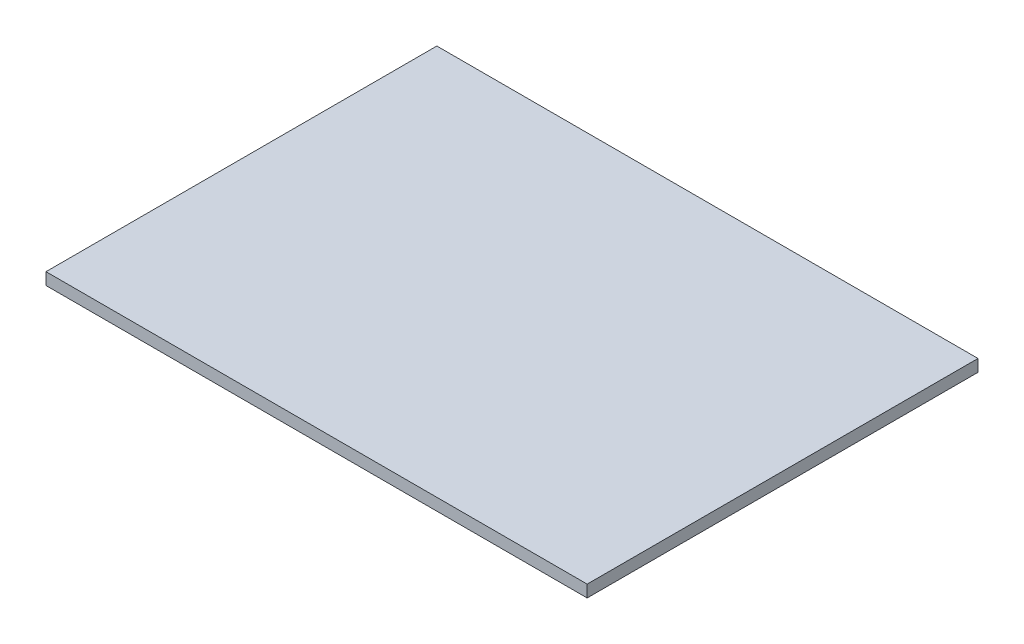
ISO-10303-21;
HEADER;
FILE_DESCRIPTION(('STEP AP214'),'2;1');
FILE_NAME('part.step','',(''),(''),'','','');
FILE_SCHEMA(('AUTOMOTIVE_DESIGN { 1 0 10303 214 1 1 1 1 }'));
ENDSEC;
DATA;
#1=APPLICATION_CONTEXT('core data for automotive mechanical design processes');
#2=APPLICATION_PROTOCOL_DEFINITION('international standard','automotive_design',2000,#1);
#3=PRODUCT_CONTEXT('',#1,'mechanical');
#4=PRODUCT('Part','Part','',(#3));
#5=PRODUCT_RELATED_PRODUCT_CATEGORY('part','',(#4));
#6=PRODUCT_DEFINITION_FORMATION('','',#4);
#7=PRODUCT_DEFINITION_CONTEXT('part definition',#1,'design');
#8=PRODUCT_DEFINITION('design','',#6,#7);
#9=PRODUCT_DEFINITION_SHAPE('','',#8);
#10=(LENGTH_UNIT() NAMED_UNIT(*) SI_UNIT(.MILLI.,.METRE.));
#11=(NAMED_UNIT(*) PLANE_ANGLE_UNIT() SI_UNIT($,.RADIAN.));
#12=(NAMED_UNIT(*) SI_UNIT($,.STERADIAN.) SOLID_ANGLE_UNIT());
#13=UNCERTAINTY_MEASURE_WITH_UNIT(LENGTH_MEASURE(1.E-05),#10,'distance_accuracy_value','');
#14=(GEOMETRIC_REPRESENTATION_CONTEXT(3) GLOBAL_UNCERTAINTY_ASSIGNED_CONTEXT((#13)) GLOBAL_UNIT_ASSIGNED_CONTEXT((#10,
#11,#12)) REPRESENTATION_CONTEXT('',''));
#15=CARTESIAN_POINT('',(0.,0.,0.));
#16=DIRECTION('',(0.,0.,1.));
#17=DIRECTION('',(1.,0.,0.));
#18=AXIS2_PLACEMENT_3D('',#15,#16,#17);
#19=CARTESIAN_POINT('',(0.,2.,0.));
#20=DIRECTION('',(1.,0.,0.));
#21=DIRECTION('',(0.,0.,-1.));
#22=AXIS2_PLACEMENT_3D('',#19,#20,#21);
#23=PLANE('',#22);
#24=DIRECTION('',(0.,0.,1.));
#25=VECTOR('',#24,1.);
#26=CARTESIAN_POINT('',(0.,0.,0.));
#27=LINE('',#26,#25);
#28=CARTESIAN_POINT('',(0.,0.,-65.));
#29=VERTEX_POINT('',#28);
#30=CARTESIAN_POINT('',(0.,0.,0.));
#31=VERTEX_POINT('',#30);
#32=EDGE_CURVE('E98',#29,#31,#27,.T.);
#33=ORIENTED_EDGE('',*,*,#32,.T.);
#34=DIRECTION('',(0.,-1.,0.));
#35=VECTOR('',#34,1.);
#36=CARTESIAN_POINT('',(0.,2.,0.));
#37=LINE('',#36,#35);
#38=CARTESIAN_POINT('',(0.,2.,0.));
#39=VERTEX_POINT('',#38);
#40=EDGE_CURVE('E11',#39,#31,#37,.T.);
#41=ORIENTED_EDGE('',*,*,#40,.F.);
#42=DIRECTION('',(0.,0.,1.));
#43=VECTOR('',#42,1.);
#44=CARTESIAN_POINT('',(0.,2.,0.));
#45=LINE('',#44,#43);
#46=CARTESIAN_POINT('',(0.,2.,-65.));
#47=VERTEX_POINT('',#46);
#48=EDGE_CURVE('E86',#47,#39,#45,.T.);
#49=ORIENTED_EDGE('',*,*,#48,.F.);
#50=DIRECTION('',(0.,-1.,0.));
#51=VECTOR('',#50,1.);
#52=CARTESIAN_POINT('',(0.,2.,-65.));
#53=LINE('',#52,#51);
#54=EDGE_CURVE('E94',#47,#29,#53,.T.);
#55=ORIENTED_EDGE('',*,*,#54,.T.);
#56=EDGE_LOOP('',(#33,#41,#49,#55));
#57=FACE_BOUND('',#56,.T.);
#58=ADVANCED_FACE('F35',(#57),#23,.F.);
#59=CARTESIAN_POINT('',(0.,2.,0.));
#60=DIRECTION('',(0.,0.,-1.));
#61=DIRECTION('',(-1.,0.,0.));
#62=AXIS2_PLACEMENT_3D('',#59,#60,#61);
#63=PLANE('',#62);
#64=DIRECTION('',(1.,0.,0.));
#65=VECTOR('',#64,1.);
#66=CARTESIAN_POINT('',(0.,0.,0.));
#67=LINE('',#66,#65);
#68=CARTESIAN_POINT('',(90.,0.,0.));
#69=VERTEX_POINT('',#68);
#70=EDGE_CURVE('E90',#31,#69,#67,.T.);
#71=ORIENTED_EDGE('',*,*,#70,.T.);
#72=DIRECTION('',(0.,-1.,0.));
#73=VECTOR('',#72,1.);
#74=CARTESIAN_POINT('',(90.,2.,0.));
#75=LINE('',#74,#73);
#76=CARTESIAN_POINT('',(90.,2.,0.));
#77=VERTEX_POINT('',#76);
#78=EDGE_CURVE('E43',#77,#69,#75,.T.);
#79=ORIENTED_EDGE('',*,*,#78,.F.);
#80=DIRECTION('',(1.,0.,0.));
#81=VECTOR('',#80,1.);
#82=CARTESIAN_POINT('',(0.,2.,0.));
#83=LINE('',#82,#81);
#84=EDGE_CURVE('E81',#39,#77,#83,.T.);
#85=ORIENTED_EDGE('',*,*,#84,.F.);
#86=ORIENTED_EDGE('',*,*,#40,.T.);
#87=EDGE_LOOP('',(#71,#79,#85,#86));
#88=FACE_BOUND('',#87,.T.);
#89=ADVANCED_FACE('F89',(#88),#63,.F.);
#90=CARTESIAN_POINT('',(90.,2.,0.));
#91=DIRECTION('',(-1.,0.,0.));
#92=DIRECTION('',(0.,0.,1.));
#93=AXIS2_PLACEMENT_3D('',#90,#91,#92);
#94=PLANE('',#93);
#95=DIRECTION('',(0.,0.,-1.));
#96=VECTOR('',#95,1.);
#97=CARTESIAN_POINT('',(90.,0.,0.));
#98=LINE('',#97,#96);
#99=CARTESIAN_POINT('',(90.,0.,-65.));
#100=VERTEX_POINT('',#99);
#101=EDGE_CURVE('E68',#69,#100,#98,.T.);
#102=ORIENTED_EDGE('',*,*,#101,.T.);
#103=DIRECTION('',(0.,-1.,0.));
#104=VECTOR('',#103,1.);
#105=CARTESIAN_POINT('',(90.,2.,-65.));
#106=LINE('',#105,#104);
#107=CARTESIAN_POINT('',(90.,2.,-65.));
#108=VERTEX_POINT('',#107);
#109=EDGE_CURVE('E91',#108,#100,#106,.T.);
#110=ORIENTED_EDGE('',*,*,#109,.F.);
#111=DIRECTION('',(0.,0.,-1.));
#112=VECTOR('',#111,1.);
#113=CARTESIAN_POINT('',(90.,2.,0.));
#114=LINE('',#113,#112);
#115=EDGE_CURVE('E84',#77,#108,#114,.T.);
#116=ORIENTED_EDGE('',*,*,#115,.F.);
#117=ORIENTED_EDGE('',*,*,#78,.T.);
#118=EDGE_LOOP('',(#102,#110,#116,#117));
#119=FACE_BOUND('',#118,.T.);
#120=ADVANCED_FACE('F92',(#119),#94,.F.);
#121=CARTESIAN_POINT('',(0.,2.,-65.));
#122=DIRECTION('',(0.,0.,1.));
#123=DIRECTION('',(1.,0.,0.));
#124=AXIS2_PLACEMENT_3D('',#121,#122,#123);
#125=PLANE('',#124);
#126=DIRECTION('',(-1.,0.,0.));
#127=VECTOR('',#126,1.);
#128=CARTESIAN_POINT('',(0.,0.,-65.));
#129=LINE('',#128,#127);
#130=EDGE_CURVE('E74',#100,#29,#129,.T.);
#131=ORIENTED_EDGE('',*,*,#130,.T.);
#132=ORIENTED_EDGE('',*,*,#54,.F.);
#133=DIRECTION('',(-1.,0.,0.));
#134=VECTOR('',#133,1.);
#135=CARTESIAN_POINT('',(0.,2.,-65.));
#136=LINE('',#135,#134);
#137=EDGE_CURVE('E51',#108,#47,#136,.T.);
#138=ORIENTED_EDGE('',*,*,#137,.F.);
#139=ORIENTED_EDGE('',*,*,#109,.T.);
#140=EDGE_LOOP('',(#131,#132,#138,#139));
#141=FACE_BOUND('',#140,.T.);
#142=ADVANCED_FACE('F105',(#141),#125,.F.);
#143=CARTESIAN_POINT('',(0.,2.,0.));
#144=DIRECTION('',(0.,-1.,0.));
#145=DIRECTION('',(0.,0.,-1.));
#146=AXIS2_PLACEMENT_3D('',#143,#144,#145);
#147=PLANE('',#146);
#148=ORIENTED_EDGE('',*,*,#48,.T.);
#149=ORIENTED_EDGE('',*,*,#84,.T.);
#150=ORIENTED_EDGE('',*,*,#115,.T.);
#151=ORIENTED_EDGE('',*,*,#137,.T.);
#152=EDGE_LOOP('',(#148,#149,#150,#151));
#153=FACE_BOUND('',#152,.T.);
#154=ADVANCED_FACE('F82',(#153),#147,.F.);
#155=CARTESIAN_POINT('',(0.,0.,0.));
#156=DIRECTION('',(0.,-1.,0.));
#157=DIRECTION('',(0.,0.,-1.));
#158=AXIS2_PLACEMENT_3D('',#155,#156,#157);
#159=PLANE('',#158);
#160=ORIENTED_EDGE('',*,*,#32,.F.);
#161=ORIENTED_EDGE('',*,*,#130,.F.);
#162=ORIENTED_EDGE('',*,*,#101,.F.);
#163=ORIENTED_EDGE('',*,*,#70,.F.);
#164=EDGE_LOOP('',(#160,#161,#162,#163));
#165=FACE_BOUND('',#164,.T.);
#166=ADVANCED_FACE('F108',(#165),#159,.T.);
#167=CLOSED_SHELL('',(#58,#89,#120,#142,#154,#166));
#168=MANIFOLD_SOLID_BREP('B2',#167);
#169=ADVANCED_BREP_SHAPE_REPRESENTATION('',(#18,#168),#14);
#170=SHAPE_DEFINITION_REPRESENTATION(#9,#169);
ENDSEC;
END-ISO-10303-21;
